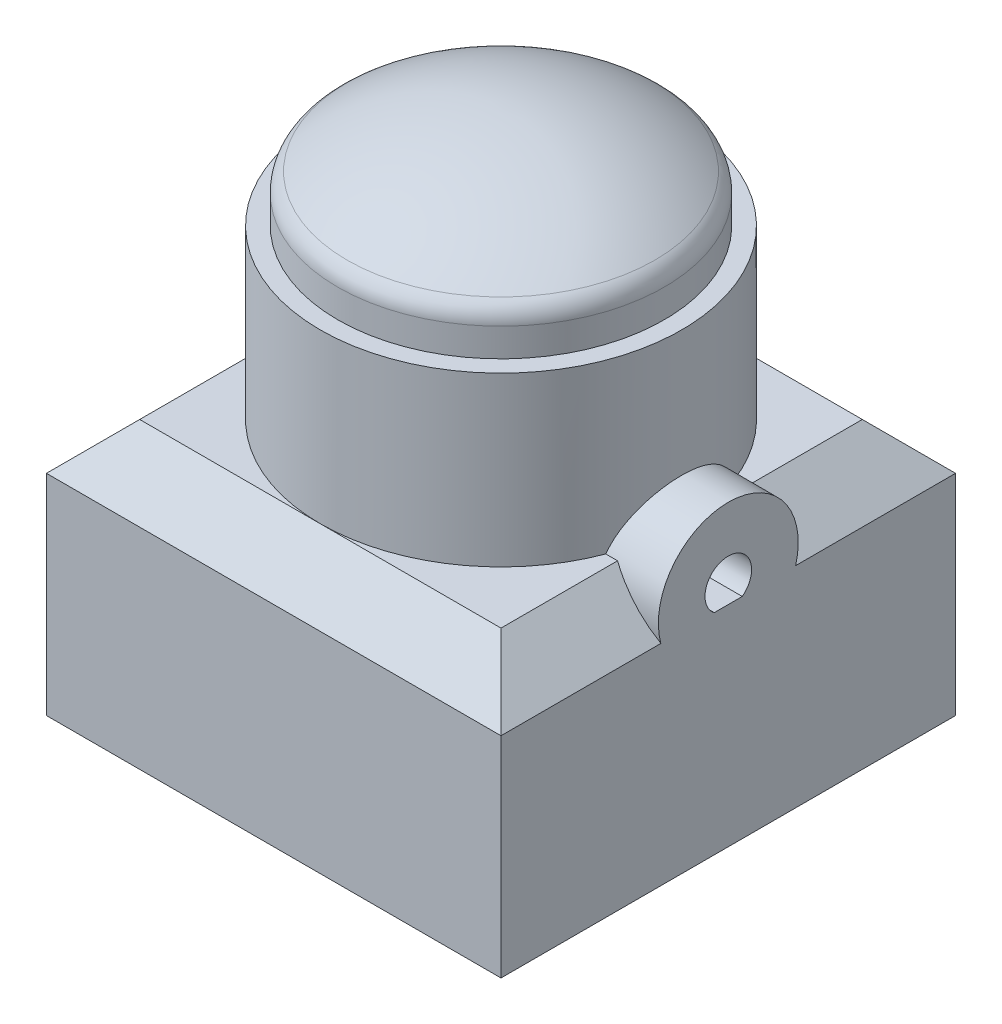
ISO-10303-21;
HEADER;
FILE_DESCRIPTION(('STEP AP214'),'2;1');
FILE_NAME('part.step','',(''),(''),'','','');
FILE_SCHEMA(('AUTOMOTIVE_DESIGN { 1 0 10303 214 1 1 1 1 }'));
ENDSEC;
DATA;
#1=APPLICATION_CONTEXT('core data for automotive mechanical design processes');
#2=APPLICATION_PROTOCOL_DEFINITION('international standard','automotive_design',2000,#1);
#3=PRODUCT_CONTEXT('',#1,'mechanical');
#4=PRODUCT('Part','Part','',(#3));
#5=PRODUCT_RELATED_PRODUCT_CATEGORY('part','',(#4));
#6=PRODUCT_DEFINITION_FORMATION('','',#4);
#7=PRODUCT_DEFINITION_CONTEXT('part definition',#1,'design');
#8=PRODUCT_DEFINITION('design','',#6,#7);
#9=PRODUCT_DEFINITION_SHAPE('','',#8);
#10=(LENGTH_UNIT() NAMED_UNIT(*) SI_UNIT(.MILLI.,.METRE.));
#11=(NAMED_UNIT(*) PLANE_ANGLE_UNIT() SI_UNIT($,.RADIAN.));
#12=(NAMED_UNIT(*) SI_UNIT($,.STERADIAN.) SOLID_ANGLE_UNIT());
#13=UNCERTAINTY_MEASURE_WITH_UNIT(LENGTH_MEASURE(1.E-05),#10,'distance_accuracy_value','');
#14=(GEOMETRIC_REPRESENTATION_CONTEXT(3) GLOBAL_UNCERTAINTY_ASSIGNED_CONTEXT((#13)) GLOBAL_UNIT_ASSIGNED_CONTEXT((#10,
#11,#12)) REPRESENTATION_CONTEXT('',''));
#15=CARTESIAN_POINT('',(0.,0.,0.));
#16=DIRECTION('',(0.,0.,1.));
#17=DIRECTION('',(1.,0.,0.));
#18=AXIS2_PLACEMENT_3D('',#15,#16,#17);
#19=CARTESIAN_POINT('',(0.,11.,0.));
#20=DIRECTION('',(0.,-1.,0.));
#21=DIRECTION('',(0.,0.,-1.));
#22=AXIS2_PLACEMENT_3D('',#19,#20,#21);
#23=PLANE('',#22);
#24=CARTESIAN_POINT('',(0.,11.,0.));
#25=DIRECTION('',(0.,1.,0.));
#26=DIRECTION('',(0.,0.,1.));
#27=AXIS2_PLACEMENT_3D('',#24,#25,#26);
#28=CIRCLE('',#27,7.75);
#29=CARTESIAN_POINT('',(0.,11.,7.75));
#30=VERTEX_POINT('',#29);
#31=CARTESIAN_POINT('',(7.24586088743084,11.,2.7495454169735));
#32=VERTEX_POINT('',#31);
#33=EDGE_CURVE('E55',#30,#32,#28,.T.);
#34=ORIENTED_EDGE('',*,*,#33,.F.);
#35=DIRECTION('',(1.,0.,0.));
#36=VECTOR('',#35,1.);
#37=CARTESIAN_POINT('',(0.,11.,7.75));
#38=LINE('',#37,#36);
#39=CARTESIAN_POINT('',(7.75,11.,7.75));
#40=VERTEX_POINT('',#39);
#41=EDGE_CURVE('E191',#30,#40,#38,.T.);
#42=ORIENTED_EDGE('',*,*,#41,.T.);
#43=DIRECTION('',(0.,0.,-1.));
#44=VECTOR('',#43,1.);
#45=CARTESIAN_POINT('',(7.75,11.,0.));
#46=LINE('',#45,#44);
#47=CARTESIAN_POINT('',(7.75,11.,2.7495454169735));
#48=VERTEX_POINT('',#47);
#49=EDGE_CURVE('E196',#40,#48,#46,.T.);
#50=ORIENTED_EDGE('',*,*,#49,.T.);
#51=DIRECTION('',(1.,0.,0.));
#52=VECTOR('',#51,1.);
#53=CARTESIAN_POINT('',(0.750000000000002,11.,2.7495454169735));
#54=LINE('',#53,#52);
#55=EDGE_CURVE('E164',#48,#32,#54,.F.);
#56=ORIENTED_EDGE('',*,*,#55,.T.);
#57=EDGE_LOOP('',(#34,#42,#50,#56));
#58=FACE_BOUND('',#57,.T.);
#59=ADVANCED_FACE('F40',(#58),#23,.F.);
#60=CARTESIAN_POINT('',(-7.75,11.,0.));
#61=VERTEX_POINT('',#60);
#62=EDGE_CURVE('E154',#61,#30,#28,.T.);
#63=ORIENTED_EDGE('',*,*,#62,.F.);
#64=DIRECTION('',(0.,0.,1.));
#65=VECTOR('',#64,1.);
#66=CARTESIAN_POINT('',(-7.75,11.,0.));
#67=LINE('',#66,#65);
#68=CARTESIAN_POINT('',(-7.75,11.,7.75));
#69=VERTEX_POINT('',#68);
#70=EDGE_CURVE('E203',#61,#69,#67,.T.);
#71=ORIENTED_EDGE('',*,*,#70,.T.);
#72=EDGE_CURVE('E192',#69,#30,#38,.T.);
#73=ORIENTED_EDGE('',*,*,#72,.T.);
#74=EDGE_LOOP('',(#63,#71,#73));
#75=FACE_BOUND('',#74,.T.);
#76=ADVANCED_FACE('F257',(#75),#23,.F.);
#77=CARTESIAN_POINT('',(0.,11.,-7.75));
#78=VERTEX_POINT('',#77);
#79=EDGE_CURVE('E288',#78,#61,#28,.T.);
#80=ORIENTED_EDGE('',*,*,#79,.F.);
#81=DIRECTION('',(-1.,0.,0.));
#82=VECTOR('',#81,1.);
#83=CARTESIAN_POINT('',(0.,11.,-7.75));
#84=LINE('',#83,#82);
#85=CARTESIAN_POINT('',(-7.75,11.,-7.75));
#86=VERTEX_POINT('',#85);
#87=EDGE_CURVE('E199',#78,#86,#84,.T.);
#88=ORIENTED_EDGE('',*,*,#87,.T.);
#89=EDGE_CURVE('E204',#86,#61,#67,.T.);
#90=ORIENTED_EDGE('',*,*,#89,.T.);
#91=EDGE_LOOP('',(#80,#88,#90));
#92=FACE_BOUND('',#91,.T.);
#93=ADVANCED_FACE('F263',(#92),#23,.F.);
#94=CARTESIAN_POINT('',(0.750000000000002,9.8,0.));
#95=DIRECTION('',(1.,0.,0.));
#96=DIRECTION('',(0.,0.,-1.));
#97=AXIS2_PLACEMENT_3D('',#94,#95,#96);
#98=CYLINDRICAL_SURFACE('',#97,3.);
#99=DIRECTION('',(1.,0.,0.));
#100=VECTOR('',#99,1.);
#101=CARTESIAN_POINT('',(0.750000000000002,11.,-2.7495454169735));
#102=LINE('',#101,#100);
#103=CARTESIAN_POINT('',(7.24586088743084,11.,-2.7495454169735));
#104=VERTEX_POINT('',#103);
#105=CARTESIAN_POINT('',(7.75,11.,-2.7495454169735));
#106=VERTEX_POINT('',#105);
#107=EDGE_CURVE('E167',#104,#106,#102,.T.);
#108=ORIENTED_EDGE('',*,*,#107,.F.);
#109=CARTESIAN_POINT('',(7.24586088743084,11.,-2.7495454169735));
#110=CARTESIAN_POINT('',(7.25888828008076,11.0786835269217,-2.71520259415597));
#111=CARTESIAN_POINT('',(7.27289504486675,11.1557081558871,-2.67756631133696));
#112=CARTESIAN_POINT('',(7.30240912504304,11.3060206308308,-2.59600063592866));
#113=CARTESIAN_POINT('',(7.31791599854309,11.3793095675856,-2.55207309474803));
#114=CARTESIAN_POINT('',(7.36597816988511,11.5928605112872,-2.41136107624833));
#115=CARTESIAN_POINT('',(7.40010479276824,11.7269764388376,-2.30557261073228));
#116=CARTESIAN_POINT('',(7.46859056424431,11.9752304762138,-2.07300003297263));
#117=CARTESIAN_POINT('',(7.50294960141876,12.0893775391893,-1.94622537987906));
#118=CARTESIAN_POINT('',(7.56820454770555,12.2949392750235,-1.67459118970335));
#119=CARTESIAN_POINT('',(7.59910092581587,12.3863570284898,-1.52973410741772));
#120=CARTESIAN_POINT('',(7.6540870052765,12.5437219692207,-1.2253081624089));
#121=CARTESIAN_POINT('',(7.67816799235652,12.609636586914,-1.06572080778775));
#122=CARTESIAN_POINT('',(7.71669648673464,12.7132868183834,-0.736541029420994));
#123=CARTESIAN_POINT('',(7.73114816753722,12.7510346409772,-0.566952974885068));
#124=CARTESIAN_POINT('',(7.74816738043278,12.7953266445899,-0.233606214587494));
#125=CARTESIAN_POINT('',(7.75139844187439,12.8036137389385,-0.0701118624461455));
#126=CARTESIAN_POINT('',(7.74748801072216,12.7935090102511,0.255904046054872));
#127=CARTESIAN_POINT('',(7.74034845569562,12.7751221707715,0.418425778435426));
#128=CARTESIAN_POINT('',(7.71687418766111,12.7134883586009,0.732353720126236));
#129=CARTESIAN_POINT('',(7.70084988559763,12.6710796242327,0.883949722031818));
#130=CARTESIAN_POINT('',(7.66141245134711,12.5635547122244,1.17782036675759));
#131=CARTESIAN_POINT('',(7.63799808518735,12.4984347421334,1.32009344806733));
#132=CARTESIAN_POINT('',(7.58496335178934,12.3445187662467,1.59734971334692));
#133=CARTESIAN_POINT('',(7.55513829326483,12.2549057809033,1.73183941758067));
#134=CARTESIAN_POINT('',(7.49277780514603,12.0556970352511,1.98437116937351));
#135=CARTESIAN_POINT('',(7.46024160691176,11.9460955974407,2.10240852697419));
#136=CARTESIAN_POINT('',(7.39477167215862,11.7062402381208,2.32236145197088));
#137=CARTESIAN_POINT('',(7.3618492341843,11.5755276388581,2.42378428416192));
#138=CARTESIAN_POINT('',(7.31548178666419,11.3679089631969,2.5590057914314));
#139=CARTESIAN_POINT('',(7.30052068105428,11.2967320439178,2.60128091940836));
#140=CARTESIAN_POINT('',(7.27202016725804,11.1508892050764,2.67991716615507));
#141=CARTESIAN_POINT('',(7.25848111733862,11.0762224131036,2.71627679585887));
#142=CARTESIAN_POINT('',(7.24586088743084,11.,2.7495454169735));
#143=B_SPLINE_CURVE_WITH_KNOTS('',3,(#109,#110,#111,#112,#113,#114,#115,#116,#117,#118,#119,
#120,#121,#122,#123,#124,#125,#126,#127,#128,#129,#130,#131,#132,#133,#134,#135,#136,#137,#138,
#139,#140,#141,#142),.UNSPECIFIED.,.F.,.F.,(4,2,2,2,2,2,2,2,2,2,2,2,2,2,2,2,4),(0.,
0.260320488265954,0.520564525522832,1.04049643753883,1.56019463443566,2.07982235580604,
2.60011151061048,3.12017501634224,3.60890623954887,4.09754616366518,4.57010162774997,
5.04273603963785,5.53361694597101,6.02463749943929,6.52828707669633,6.78041165772617,
7.03259960640103),.UNSPECIFIED.);
#144=EDGE_CURVE('E230',#104,#32,#143,.T.);
#145=ORIENTED_EDGE('',*,*,#144,.T.);
#146=ORIENTED_EDGE('',*,*,#55,.F.);
#147=CARTESIAN_POINT('',(8.95,9.8,0.));
#148=DIRECTION('',(-0.707106781186549,-0.707106781186546,0.));
#149=DIRECTION('',(0.707106781186546,-0.707106781186549,0.));
#150=AXIS2_PLACEMENT_3D('',#147,#148,#149);
#151=ELLIPSE('',#150,4.24264068711928,3.);
#152=CARTESIAN_POINT('',(9.75,8.99999999999999,2.89136645896019));
#153=VERTEX_POINT('',#152);
#154=EDGE_CURVE('E218',#48,#153,#151,.F.);
#155=ORIENTED_EDGE('',*,*,#154,.T.);
#156=CARTESIAN_POINT('',(9.75,9.8,0.));
#157=DIRECTION('',(1.,0.,0.));
#158=DIRECTION('',(0.,0.,-1.));
#159=AXIS2_PLACEMENT_3D('',#156,#157,#158);
#160=CIRCLE('',#159,3.);
#161=CARTESIAN_POINT('',(9.75,8.99999999999999,-2.89136645896019));
#162=VERTEX_POINT('',#161);
#163=EDGE_CURVE('E159',#162,#153,#160,.T.);
#164=ORIENTED_EDGE('',*,*,#163,.F.);
#165=EDGE_CURVE('E229',#162,#106,#151,.F.);
#166=ORIENTED_EDGE('',*,*,#165,.T.);
#167=EDGE_LOOP('',(#108,#145,#146,#155,#164,#166));
#168=FACE_BOUND('',#167,.T.);
#169=ADVANCED_FACE('F238',(#168),#98,.T.);
#170=CARTESIAN_POINT('',(7.75,11.,0.));
#171=DIRECTION('',(-0.707106781186549,-0.707106781186546,0.));
#172=DIRECTION('',(0.,0.,-1.));
#173=AXIS2_PLACEMENT_3D('',#170,#171,#172);
#174=PLANE('',#173);
#175=ORIENTED_EDGE('',*,*,#165,.F.);
#176=DIRECTION('',(0.,0.,1.));
#177=VECTOR('',#176,1.);
#178=CARTESIAN_POINT('',(9.75,8.99999999999999,9.75));
#179=LINE('',#178,#177);
#180=CARTESIAN_POINT('',(9.75,8.99999999999999,-9.75));
#181=VERTEX_POINT('',#180);
#182=EDGE_CURVE('E212',#181,#162,#179,.T.);
#183=ORIENTED_EDGE('',*,*,#182,.F.);
#184=DIRECTION('',(-0.577350269189625,0.577350269189627,0.577350269189625));
#185=VECTOR('',#184,1.);
#186=CARTESIAN_POINT('',(5.16666666666667,13.5833333333333,-5.16666666666667));
#187=LINE('',#186,#185);
#188=CARTESIAN_POINT('',(7.75,11.,-7.75));
#189=VERTEX_POINT('',#188);
#190=EDGE_CURVE('E174',#189,#181,#187,.F.);
#191=ORIENTED_EDGE('',*,*,#190,.F.);
#192=EDGE_CURVE('E195',#106,#189,#46,.T.);
#193=ORIENTED_EDGE('',*,*,#192,.F.);
#194=EDGE_LOOP('',(#175,#183,#191,#193));
#195=FACE_BOUND('',#194,.T.);
#196=ADVANCED_FACE('F285',(#195),#174,.F.);
#197=CARTESIAN_POINT('',(9.75,11.,9.75));
#198=DIRECTION('',(-1.,0.,0.));
#199=DIRECTION('',(0.,0.,1.));
#200=AXIS2_PLACEMENT_3D('',#197,#198,#199);
#201=PLANE('',#200);
#202=ORIENTED_EDGE('',*,*,#163,.T.);
#203=CARTESIAN_POINT('',(9.75,8.99999999999999,9.75));
#204=VERTEX_POINT('',#203);
#205=EDGE_CURVE('E63',#153,#204,#179,.T.);
#206=ORIENTED_EDGE('',*,*,#205,.T.);
#207=DIRECTION('',(0.,-1.,0.));
#208=VECTOR('',#207,1.);
#209=CARTESIAN_POINT('',(9.75,11.,9.75));
#210=LINE('',#209,#208);
#211=CARTESIAN_POINT('',(9.75,0.,9.75));
#212=VERTEX_POINT('',#211);
#213=EDGE_CURVE('E183',#204,#212,#210,.T.);
#214=ORIENTED_EDGE('',*,*,#213,.T.);
#215=DIRECTION('',(0.,0.,-1.));
#216=VECTOR('',#215,1.);
#217=CARTESIAN_POINT('',(9.75,0.,9.75));
#218=LINE('',#217,#216);
#219=CARTESIAN_POINT('',(9.75,0.,-9.75));
#220=VERTEX_POINT('',#219);
#221=EDGE_CURVE('E170',#212,#220,#218,.T.);
#222=ORIENTED_EDGE('',*,*,#221,.T.);
#223=DIRECTION('',(0.,-1.,0.));
#224=VECTOR('',#223,1.);
#225=CARTESIAN_POINT('',(9.75,11.,-9.75));
#226=LINE('',#225,#224);
#227=EDGE_CURVE('E189',#181,#220,#226,.T.);
#228=ORIENTED_EDGE('',*,*,#227,.F.);
#229=ORIENTED_EDGE('',*,*,#182,.T.);
#230=EDGE_LOOP('',(#202,#206,#214,#222,#228,#229));
#231=FACE_BOUND('',#230,.T.);
#232=CARTESIAN_POINT('',(9.75,8.99999999999999,-0.599999999999998));
#233=VERTEX_POINT('',#232);
#234=CARTESIAN_POINT('',(9.75,8.99999999999999,0.599999999999997));
#235=VERTEX_POINT('',#234);
#236=EDGE_CURVE('E216',#233,#235,#179,.T.);
#237=ORIENTED_EDGE('',*,*,#236,.T.);
#238=CARTESIAN_POINT('',(9.75,9.8,0.));
#239=DIRECTION('',(1.,0.,0.));
#240=DIRECTION('',(0.,0.,-1.));
#241=AXIS2_PLACEMENT_3D('',#238,#239,#240);
#242=CIRCLE('',#241,1.);
#243=EDGE_CURVE('E139',#233,#235,#242,.T.);
#244=ORIENTED_EDGE('',*,*,#243,.F.);
#245=EDGE_LOOP('',(#237,#244));
#246=FACE_BOUND('',#245,.T.);
#247=ADVANCED_FACE('F327',(#231,#246),#201,.F.);
#248=CARTESIAN_POINT('',(-9.75,11.,-9.75));
#249=DIRECTION('',(0.,0.,1.));
#250=DIRECTION('',(1.,0.,0.));
#251=AXIS2_PLACEMENT_3D('',#248,#249,#250);
#252=PLANE('',#251);
#253=DIRECTION('',(0.,-1.,0.));
#254=VECTOR('',#253,1.);
#255=CARTESIAN_POINT('',(-9.75,11.,-9.75));
#256=LINE('',#255,#254);
#257=CARTESIAN_POINT('',(-9.75,8.99999999999999,-9.75));
#258=VERTEX_POINT('',#257);
#259=CARTESIAN_POINT('',(-9.75,0.,-9.75));
#260=VERTEX_POINT('',#259);
#261=EDGE_CURVE('E187',#258,#260,#256,.T.);
#262=ORIENTED_EDGE('',*,*,#261,.F.);
#263=DIRECTION('',(1.,0.,0.));
#264=VECTOR('',#263,1.);
#265=CARTESIAN_POINT('',(-9.75,8.99999999999999,-9.75));
#266=LINE('',#265,#264);
#267=EDGE_CURVE('E210',#258,#181,#266,.T.);
#268=ORIENTED_EDGE('',*,*,#267,.T.);
#269=ORIENTED_EDGE('',*,*,#227,.T.);
#270=DIRECTION('',(-1.,0.,0.));
#271=VECTOR('',#270,1.);
#272=CARTESIAN_POINT('',(-9.75,0.,-9.75));
#273=LINE('',#272,#271);
#274=EDGE_CURVE('E173',#220,#260,#273,.T.);
#275=ORIENTED_EDGE('',*,*,#274,.T.);
#276=EDGE_LOOP('',(#262,#268,#269,#275));
#277=FACE_BOUND('',#276,.T.);
#278=ADVANCED_FACE('F311',(#277),#252,.F.);
#279=CARTESIAN_POINT('',(-9.75,11.,9.75));
#280=DIRECTION('',(1.,0.,0.));
#281=DIRECTION('',(0.,0.,-1.));
#282=AXIS2_PLACEMENT_3D('',#279,#280,#281);
#283=PLANE('',#282);
#284=DIRECTION('',(0.,-1.,0.));
#285=VECTOR('',#284,1.);
#286=CARTESIAN_POINT('',(-9.75,11.,9.75));
#287=LINE('',#286,#285);
#288=CARTESIAN_POINT('',(-9.75,8.99999999999999,9.75));
#289=VERTEX_POINT('',#288);
#290=CARTESIAN_POINT('',(-9.75,0.,9.75));
#291=VERTEX_POINT('',#290);
#292=EDGE_CURVE('E185',#289,#291,#287,.T.);
#293=ORIENTED_EDGE('',*,*,#292,.F.);
#294=DIRECTION('',(0.,0.,-1.));
#295=VECTOR('',#294,1.);
#296=CARTESIAN_POINT('',(-9.75,8.99999999999999,9.75));
#297=LINE('',#296,#295);
#298=EDGE_CURVE('E207',#289,#258,#297,.T.);
#299=ORIENTED_EDGE('',*,*,#298,.T.);
#300=ORIENTED_EDGE('',*,*,#261,.T.);
#301=DIRECTION('',(0.,0.,1.));
#302=VECTOR('',#301,1.);
#303=CARTESIAN_POINT('',(-9.75,0.,9.75));
#304=LINE('',#303,#302);
#305=EDGE_CURVE('E177',#260,#291,#304,.T.);
#306=ORIENTED_EDGE('',*,*,#305,.T.);
#307=EDGE_LOOP('',(#293,#299,#300,#306));
#308=FACE_BOUND('',#307,.T.);
#309=ADVANCED_FACE('F276',(#308),#283,.F.);
#310=CARTESIAN_POINT('',(-9.75,11.,9.75));
#311=DIRECTION('',(0.,0.,-1.));
#312=DIRECTION('',(-1.,0.,0.));
#313=AXIS2_PLACEMENT_3D('',#310,#311,#312);
#314=PLANE('',#313);
#315=ORIENTED_EDGE('',*,*,#213,.F.);
#316=DIRECTION('',(-1.,0.,0.));
#317=VECTOR('',#316,1.);
#318=CARTESIAN_POINT('',(-9.75,8.99999999999999,9.75));
#319=LINE('',#318,#317);
#320=EDGE_CURVE('E215',#204,#289,#319,.T.);
#321=ORIENTED_EDGE('',*,*,#320,.T.);
#322=ORIENTED_EDGE('',*,*,#292,.T.);
#323=DIRECTION('',(1.,0.,0.));
#324=VECTOR('',#323,1.);
#325=CARTESIAN_POINT('',(-9.75,0.,9.75));
#326=LINE('',#325,#324);
#327=EDGE_CURVE('E180',#291,#212,#326,.T.);
#328=ORIENTED_EDGE('',*,*,#327,.T.);
#329=EDGE_LOOP('',(#315,#321,#322,#328));
#330=FACE_BOUND('',#329,.T.);
#331=ADVANCED_FACE('F268',(#330),#314,.F.);
#332=EDGE_CURVE('E161',#104,#78,#28,.T.);
#333=ORIENTED_EDGE('',*,*,#332,.F.);
#334=ORIENTED_EDGE('',*,*,#107,.T.);
#335=ORIENTED_EDGE('',*,*,#192,.T.);
#336=EDGE_CURVE('E200',#189,#78,#84,.T.);
#337=ORIENTED_EDGE('',*,*,#336,.T.);
#338=EDGE_LOOP('',(#333,#334,#335,#337));
#339=FACE_BOUND('',#338,.T.);
#340=ADVANCED_FACE('F259',(#339),#23,.F.);
#341=CARTESIAN_POINT('',(0.,0.,0.));
#342=DIRECTION('',(0.,-1.,0.));
#343=DIRECTION('',(0.,0.,-1.));
#344=AXIS2_PLACEMENT_3D('',#341,#342,#343);
#345=PLANE('',#344);
#346=ORIENTED_EDGE('',*,*,#221,.F.);
#347=ORIENTED_EDGE('',*,*,#327,.F.);
#348=ORIENTED_EDGE('',*,*,#305,.F.);
#349=ORIENTED_EDGE('',*,*,#274,.F.);
#350=EDGE_LOOP('',(#346,#347,#348,#349));
#351=FACE_BOUND('',#350,.T.);
#352=ADVANCED_FACE('F267',(#351),#345,.T.);
#353=ORIENTED_EDGE('',*,*,#154,.F.);
#354=ORIENTED_EDGE('',*,*,#49,.F.);
#355=DIRECTION('',(-0.577350269189625,0.577350269189627,-0.577350269189625));
#356=VECTOR('',#355,1.);
#357=CARTESIAN_POINT('',(5.16666666666667,13.5833333333333,5.16666666666667));
#358=LINE('',#357,#356);
#359=EDGE_CURVE('E223',#204,#40,#358,.T.);
#360=ORIENTED_EDGE('',*,*,#359,.F.);
#361=ORIENTED_EDGE('',*,*,#205,.F.);
#362=EDGE_LOOP('',(#353,#354,#360,#361));
#363=FACE_BOUND('',#362,.T.);
#364=ADVANCED_FACE('F274',(#363),#174,.F.);
#365=CARTESIAN_POINT('',(0.,11.,-7.75));
#366=DIRECTION('',(0.,-0.707106781186546,0.707106781186549));
#367=DIRECTION('',(-1.,0.,0.));
#368=AXIS2_PLACEMENT_3D('',#365,#366,#367);
#369=PLANE('',#368);
#370=ORIENTED_EDGE('',*,*,#190,.T.);
#371=ORIENTED_EDGE('',*,*,#267,.F.);
#372=DIRECTION('',(0.577350269189625,0.577350269189627,0.577350269189625));
#373=VECTOR('',#372,1.);
#374=CARTESIAN_POINT('',(-5.16666666666667,13.5833333333333,-5.16666666666667));
#375=LINE('',#374,#373);
#376=EDGE_CURVE('E221',#86,#258,#375,.F.);
#377=ORIENTED_EDGE('',*,*,#376,.F.);
#378=ORIENTED_EDGE('',*,*,#87,.F.);
#379=ORIENTED_EDGE('',*,*,#336,.F.);
#380=EDGE_LOOP('',(#370,#371,#377,#378,#379));
#381=FACE_BOUND('',#380,.T.);
#382=ADVANCED_FACE('F295',(#381),#369,.F.);
#383=CARTESIAN_POINT('',(0.,11.,7.75));
#384=DIRECTION('',(0.,-0.707106781186546,-0.707106781186549));
#385=DIRECTION('',(1.,0.,0.));
#386=AXIS2_PLACEMENT_3D('',#383,#384,#385);
#387=PLANE('',#386);
#388=ORIENTED_EDGE('',*,*,#359,.T.);
#389=ORIENTED_EDGE('',*,*,#41,.F.);
#390=ORIENTED_EDGE('',*,*,#72,.F.);
#391=DIRECTION('',(-0.577350269189625,-0.577350269189627,0.577350269189625));
#392=VECTOR('',#391,1.);
#393=CARTESIAN_POINT('',(-5.16666666666667,13.5833333333333,5.16666666666667));
#394=LINE('',#393,#392);
#395=EDGE_CURVE('E169',#289,#69,#394,.F.);
#396=ORIENTED_EDGE('',*,*,#395,.F.);
#397=ORIENTED_EDGE('',*,*,#320,.F.);
#398=EDGE_LOOP('',(#388,#389,#390,#396,#397));
#399=FACE_BOUND('',#398,.T.);
#400=ADVANCED_FACE('F253',(#399),#387,.F.);
#401=CARTESIAN_POINT('',(-7.75,11.,0.));
#402=DIRECTION('',(0.707106781186549,-0.707106781186546,0.));
#403=DIRECTION('',(0.,0.,1.));
#404=AXIS2_PLACEMENT_3D('',#401,#402,#403);
#405=PLANE('',#404);
#406=ORIENTED_EDGE('',*,*,#376,.T.);
#407=ORIENTED_EDGE('',*,*,#298,.F.);
#408=ORIENTED_EDGE('',*,*,#395,.T.);
#409=ORIENTED_EDGE('',*,*,#70,.F.);
#410=ORIENTED_EDGE('',*,*,#89,.F.);
#411=EDGE_LOOP('',(#406,#407,#408,#409,#410));
#412=FACE_BOUND('',#411,.T.);
#413=ADVANCED_FACE('F249',(#412),#405,.F.);
#414=CARTESIAN_POINT('',(0.750000000000002,9.8,0.));
#415=DIRECTION('',(1.,0.,0.));
#416=DIRECTION('',(0.,0.,-1.));
#417=AXIS2_PLACEMENT_3D('',#414,#415,#416);
#418=CYLINDRICAL_SURFACE('',#417,1.);
#419=ORIENTED_EDGE('',*,*,#243,.T.);
#420=DIRECTION('',(1.,0.,0.));
#421=VECTOR('',#420,1.);
#422=CARTESIAN_POINT('',(6.55,8.99999999999999,0.599999999999997));
#423=LINE('',#422,#421);
#424=CARTESIAN_POINT('',(6.55,8.99999999999999,0.599999999999997));
#425=VERTEX_POINT('',#424);
#426=EDGE_CURVE('E133',#425,#235,#423,.T.);
#427=ORIENTED_EDGE('',*,*,#426,.F.);
#428=CARTESIAN_POINT('',(6.55,9.8,0.));
#429=DIRECTION('',(1.,0.,0.));
#430=DIRECTION('',(0.,0.,-1.));
#431=AXIS2_PLACEMENT_3D('',#428,#429,#430);
#432=CIRCLE('',#431,1.);
#433=CARTESIAN_POINT('',(6.55,8.99999999999999,-0.599999999999998));
#434=VERTEX_POINT('',#433);
#435=EDGE_CURVE('E136',#434,#425,#432,.T.);
#436=ORIENTED_EDGE('',*,*,#435,.F.);
#437=DIRECTION('',(1.,0.,0.));
#438=VECTOR('',#437,1.);
#439=CARTESIAN_POINT('',(6.55,8.99999999999999,-0.599999999999998));
#440=LINE('',#439,#438);
#441=EDGE_CURVE('E144',#434,#233,#440,.T.);
#442=ORIENTED_EDGE('',*,*,#441,.T.);
#443=EDGE_LOOP('',(#419,#427,#436,#442));
#444=FACE_BOUND('',#443,.T.);
#445=ADVANCED_FACE('F135',(#444),#418,.F.);
#446=CARTESIAN_POINT('',(0.,18.2,0.));
#447=DIRECTION('',(0.,-1.,0.));
#448=DIRECTION('',(0.,0.,-1.));
#449=AXIS2_PLACEMENT_3D('',#446,#447,#448);
#450=CYLINDRICAL_SURFACE('',#449,7.75);
#451=ORIENTED_EDGE('',*,*,#144,.F.);
#452=ORIENTED_EDGE('',*,*,#332,.T.);
#453=ORIENTED_EDGE('',*,*,#79,.T.);
#454=ORIENTED_EDGE('',*,*,#62,.T.);
#455=ORIENTED_EDGE('',*,*,#33,.T.);
#456=EDGE_LOOP('',(#451,#452,#453,#454,#455));
#457=FACE_BOUND('',#456,.T.);
#458=CARTESIAN_POINT('',(0.,18.2,0.));
#459=DIRECTION('',(0.,1.,0.));
#460=DIRECTION('',(0.,0.,1.));
#461=AXIS2_PLACEMENT_3D('',#458,#459,#460);
#462=CIRCLE('',#461,7.75);
#463=CARTESIAN_POINT('',(0.,18.2,7.75));
#464=VERTEX_POINT('',#463);
#465=EDGE_CURVE('E156',#464,#464,#462,.T.);
#466=ORIENTED_EDGE('',*,*,#465,.F.);
#467=EDGE_LOOP('',(#466));
#468=FACE_BOUND('',#467,.T.);
#469=ADVANCED_FACE('F242',(#457,#468),#450,.T.);
#470=CARTESIAN_POINT('',(0.,18.2,0.));
#471=DIRECTION('',(0.,1.,0.));
#472=DIRECTION('',(0.,0.,1.));
#473=AXIS2_PLACEMENT_3D('',#470,#471,#472);
#474=PLANE('',#473);
#475=CARTESIAN_POINT('',(0.,18.2,0.));
#476=DIRECTION('',(0.,1.,0.));
#477=DIRECTION('',(0.,0.,1.));
#478=AXIS2_PLACEMENT_3D('',#475,#476,#477);
#479=CIRCLE('',#478,7.);
#480=CARTESIAN_POINT('',(0.,18.2,7.));
#481=VERTEX_POINT('',#480);
#482=EDGE_CURVE('E237',#481,#481,#479,.T.);
#483=ORIENTED_EDGE('',*,*,#482,.F.);
#484=EDGE_LOOP('',(#483));
#485=FACE_BOUND('',#484,.T.);
#486=ORIENTED_EDGE('',*,*,#465,.T.);
#487=EDGE_LOOP('',(#486));
#488=FACE_BOUND('',#487,.T.);
#489=ADVANCED_FACE('F246',(#485,#488),#474,.T.);
#490=CARTESIAN_POINT('',(6.55,8.99999999999999,0.599999999999997));
#491=DIRECTION('',(0.,-1.,0.));
#492=DIRECTION('',(0.,0.,-1.));
#493=AXIS2_PLACEMENT_3D('',#490,#491,#492);
#494=PLANE('',#493);
#495=ORIENTED_EDGE('',*,*,#236,.F.);
#496=ORIENTED_EDGE('',*,*,#441,.F.);
#497=DIRECTION('',(0.,0.,-1.));
#498=VECTOR('',#497,1.);
#499=CARTESIAN_POINT('',(6.55,8.99999999999999,0.599999999999997));
#500=LINE('',#499,#498);
#501=EDGE_CURVE('E145',#425,#434,#500,.T.);
#502=ORIENTED_EDGE('',*,*,#501,.F.);
#503=ORIENTED_EDGE('',*,*,#426,.T.);
#504=EDGE_LOOP('',(#495,#496,#502,#503));
#505=FACE_BOUND('',#504,.T.);
#506=ADVANCED_FACE('F150',(#505),#494,.F.);
#507=CARTESIAN_POINT('',(6.55,9.8,0.));
#508=DIRECTION('',(1.,0.,0.));
#509=DIRECTION('',(0.,0.,-1.));
#510=AXIS2_PLACEMENT_3D('',#507,#508,#509);
#511=PLANE('',#510);
#512=ORIENTED_EDGE('',*,*,#435,.T.);
#513=ORIENTED_EDGE('',*,*,#501,.T.);
#514=EDGE_LOOP('',(#512,#513));
#515=FACE_BOUND('',#514,.T.);
#516=ADVANCED_FACE('F148',(#515),#511,.T.);
#517=CARTESIAN_POINT('',(0.,19.9,0.));
#518=DIRECTION('',(0.,-1.,0.));
#519=DIRECTION('',(0.,0.,-1.));
#520=AXIS2_PLACEMENT_3D('',#517,#518,#519);
#521=CYLINDRICAL_SURFACE('',#520,7.);
#522=CARTESIAN_POINT('',(0.,19.412412790226,0.));
#523=DIRECTION('',(0.,-1.,0.));
#524=DIRECTION('',(0.,0.,-1.));
#525=AXIS2_PLACEMENT_3D('',#522,#523,#524);
#526=CIRCLE('',#525,7.);
#527=CARTESIAN_POINT('',(0.,19.412412790226,-7.));
#528=VERTEX_POINT('',#527);
#529=EDGE_CURVE('E11',#528,#528,#526,.T.);
#530=ORIENTED_EDGE('',*,*,#529,.T.);
#531=EDGE_LOOP('',(#530));
#532=FACE_BOUND('',#531,.T.);
#533=ORIENTED_EDGE('',*,*,#482,.T.);
#534=EDGE_LOOP('',(#533));
#535=FACE_BOUND('',#534,.T.);
#536=ADVANCED_FACE('F356',(#532,#535),#521,.T.);
#537=CARTESIAN_POINT('',(0.,11.35,0.));
#538=DIRECTION('',(0.,0.,1.));
#539=DIRECTION('',(1.,0.,0.));
#540=AXIS2_PLACEMENT_3D('',#537,#538,#539);
#541=SPHERICAL_SURFACE('',#540,11.05);
#542=CARTESIAN_POINT('',(0.,11.35,0.));
#543=DIRECTION('',(0.,-1.,0.));
#544=DIRECTION('',(0.,0.,-1.));
#545=AXIS2_PLACEMENT_3D('',#542,#543,#544);
#546=SPHERICAL_SURFACE('',#545,11.05);
#547=CARTESIAN_POINT('',(0.,20.2146429186067,0.));
#548=DIRECTION('',(0.,-1.,0.));
#549=DIRECTION('',(0.,0.,-1.));
#550=AXIS2_PLACEMENT_3D('',#547,#548,#549);
#551=CIRCLE('',#550,6.59701492537313);
#552=CARTESIAN_POINT('',(0.,20.2146429186067,-6.59701492537313));
#553=VERTEX_POINT('',#552);
#554=EDGE_CURVE('E48',#553,#553,#551,.F.);
#555=ORIENTED_EDGE('',*,*,#554,.T.);
#556=EDGE_LOOP('',(#555));
#557=FACE_BOUND('',#556,.T.);
#558=ADVANCED_FACE('F354',(#557),#546,.T.);
#559=CARTESIAN_POINT('',(0.,19.412412790226,0.));
#560=DIRECTION('',(0.,-1.,0.));
#561=DIRECTION('',(0.,0.,-1.));
#562=AXIS2_PLACEMENT_3D('',#559,#560,#561);
#563=TOROIDAL_SURFACE('',#562,6.,1.);
#564=ORIENTED_EDGE('',*,*,#529,.F.);
#565=EDGE_LOOP('',(#564));
#566=FACE_BOUND('',#565,.T.);
#567=ORIENTED_EDGE('',*,*,#554,.F.);
#568=EDGE_LOOP('',(#567));
#569=FACE_BOUND('',#568,.T.);
#570=ADVANCED_FACE('F42',(#566,#569),#563,.T.);
#571=CLOSED_SHELL('',(#59,#76,#93,#169,#196,#247,#278,#309,#331,#340,#352,#364,#382,#400,#413,
#445,#469,#489,#506,#516,#536,#558,#570));
#572=MANIFOLD_SOLID_BREP('B2',#571);
#573=ADVANCED_BREP_SHAPE_REPRESENTATION('',(#18,#572),#14);
#574=SHAPE_DEFINITION_REPRESENTATION(#9,#573);
ENDSEC;
END-ISO-10303-21;
